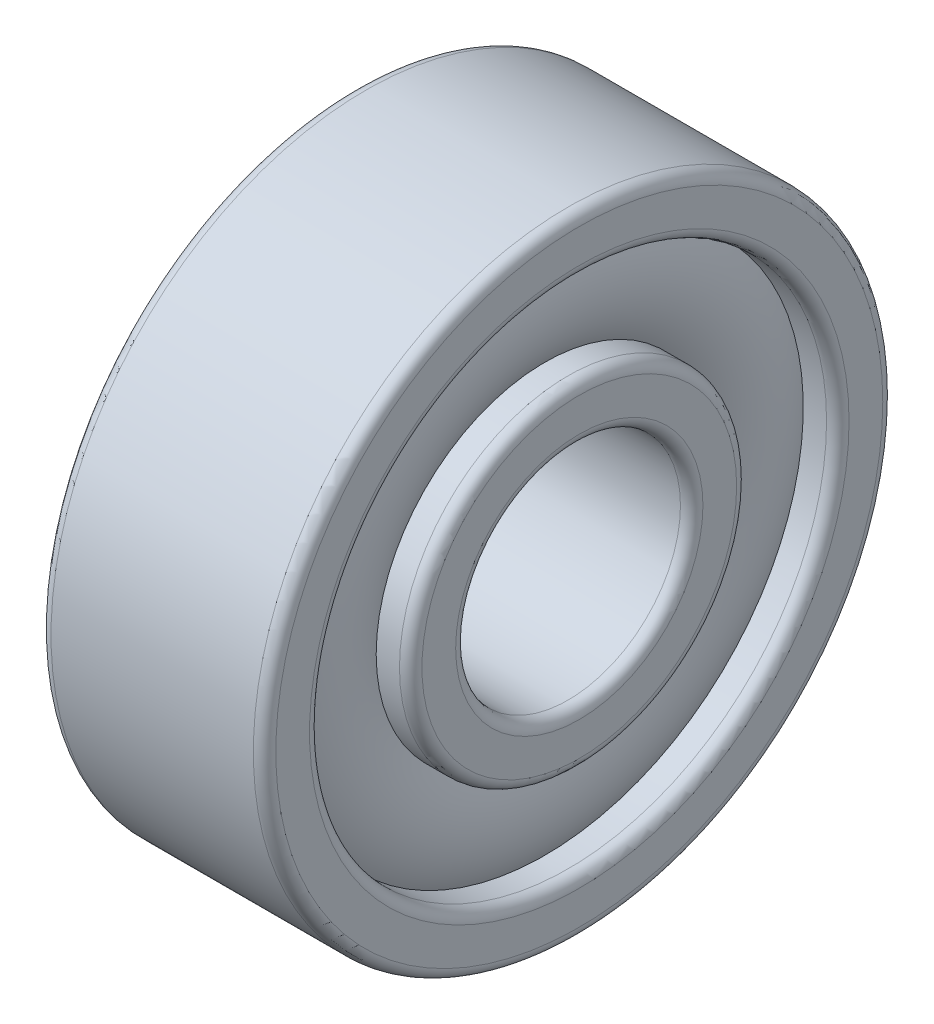
ISO-10303-21;
HEADER;
FILE_DESCRIPTION(('STEP AP214'),'2;1');
FILE_NAME('part.step','',(''),(''),'','','');
FILE_SCHEMA(('AUTOMOTIVE_DESIGN { 1 0 10303 214 1 1 1 1 }'));
ENDSEC;
DATA;
#1=APPLICATION_CONTEXT('core data for automotive mechanical design processes');
#2=APPLICATION_PROTOCOL_DEFINITION('international standard','automotive_design',2000,#1);
#3=PRODUCT_CONTEXT('',#1,'mechanical');
#4=PRODUCT('Part','Part','',(#3));
#5=PRODUCT_RELATED_PRODUCT_CATEGORY('part','',(#4));
#6=PRODUCT_DEFINITION_FORMATION('','',#4);
#7=PRODUCT_DEFINITION_CONTEXT('part definition',#1,'design');
#8=PRODUCT_DEFINITION('design','',#6,#7);
#9=PRODUCT_DEFINITION_SHAPE('','',#8);
#10=(LENGTH_UNIT() NAMED_UNIT(*) SI_UNIT(.MILLI.,.METRE.));
#11=(NAMED_UNIT(*) PLANE_ANGLE_UNIT() SI_UNIT($,.RADIAN.));
#12=(NAMED_UNIT(*) SI_UNIT($,.STERADIAN.) SOLID_ANGLE_UNIT());
#13=UNCERTAINTY_MEASURE_WITH_UNIT(LENGTH_MEASURE(1.E-05),#10,'distance_accuracy_value','');
#14=(GEOMETRIC_REPRESENTATION_CONTEXT(3) GLOBAL_UNCERTAINTY_ASSIGNED_CONTEXT((#13)) GLOBAL_UNIT_ASSIGNED_CONTEXT((#10,
#11,#12)) REPRESENTATION_CONTEXT('',''));
#15=CARTESIAN_POINT('',(0.,0.,0.));
#16=DIRECTION('',(0.,0.,1.));
#17=DIRECTION('',(1.,0.,0.));
#18=AXIS2_PLACEMENT_3D('',#15,#16,#17);
#19=CARTESIAN_POINT('',(-5.57838983751132,0.,0.));
#20=DIRECTION('',(-1.,0.,0.));
#21=DIRECTION('',(0.,0.,1.));
#22=AXIS2_PLACEMENT_3D('',#19,#20,#21);
#23=CYLINDRICAL_SURFACE('',#22,3.75);
#24=CARTESIAN_POINT('',(2.25,0.,0.));
#25=DIRECTION('',(1.,0.,0.));
#26=DIRECTION('',(0.,0.,-1.));
#27=AXIS2_PLACEMENT_3D('',#24,#25,#26);
#28=CIRCLE('',#27,3.75);
#29=CARTESIAN_POINT('',(2.25,0.,-3.75));
#30=VERTEX_POINT('',#29);
#31=EDGE_CURVE('E78',#30,#30,#28,.F.);
#32=ORIENTED_EDGE('',*,*,#31,.T.);
#33=EDGE_LOOP('',(#32));
#34=FACE_BOUND('',#33,.T.);
#35=CARTESIAN_POINT('',(1.73205080756888,0.,0.));
#36=DIRECTION('',(-1.,0.,0.));
#37=DIRECTION('',(0.,0.,1.));
#38=AXIS2_PLACEMENT_3D('',#35,#36,#37);
#39=CIRCLE('',#38,3.75);
#40=CARTESIAN_POINT('',(1.73205080756888,0.,3.75));
#41=VERTEX_POINT('',#40);
#42=EDGE_CURVE('E93',#41,#41,#39,.T.);
#43=ORIENTED_EDGE('',*,*,#42,.F.);
#44=EDGE_LOOP('',(#43));
#45=FACE_BOUND('',#44,.T.);
#46=ADVANCED_FACE('F37',(#34,#45),#23,.T.);
#47=CARTESIAN_POINT('',(0.,0.,0.));
#48=DIRECTION('',(-1.,0.,0.));
#49=DIRECTION('',(0.,0.,1.));
#50=AXIS2_PLACEMENT_3D('',#47,#48,#49);
#51=TOROIDAL_SURFACE('',#50,4.75,2.);
#52=CARTESIAN_POINT('',(1.73205080756888,0.,0.));
#53=DIRECTION('',(-1.,0.,0.));
#54=DIRECTION('',(0.,0.,1.));
#55=AXIS2_PLACEMENT_3D('',#52,#53,#54);
#56=CIRCLE('',#55,5.75);
#57=CARTESIAN_POINT('',(1.73205080756888,0.,5.75));
#58=VERTEX_POINT('',#57);
#59=EDGE_CURVE('E96',#58,#58,#56,.T.);
#60=ORIENTED_EDGE('',*,*,#59,.F.);
#61=EDGE_LOOP('',(#60));
#62=FACE_BOUND('',#61,.T.);
#63=ORIENTED_EDGE('',*,*,#42,.T.);
#64=EDGE_LOOP('',(#63));
#65=FACE_BOUND('',#64,.T.);
#66=ADVANCED_FACE('F126',(#62,#65),#51,.T.);
#67=CARTESIAN_POINT('',(-5.57838983751132,0.,0.));
#68=DIRECTION('',(-1.,0.,0.));
#69=DIRECTION('',(0.,0.,1.));
#70=AXIS2_PLACEMENT_3D('',#67,#68,#69);
#71=CYLINDRICAL_SURFACE('',#70,5.75);
#72=CARTESIAN_POINT('',(2.25,0.,0.));
#73=DIRECTION('',(1.,0.,0.));
#74=DIRECTION('',(0.,0.,-1.));
#75=AXIS2_PLACEMENT_3D('',#72,#73,#74);
#76=CIRCLE('',#75,5.75);
#77=CARTESIAN_POINT('',(2.25,0.,-5.75));
#78=VERTEX_POINT('',#77);
#79=EDGE_CURVE('E48',#78,#78,#76,.T.);
#80=ORIENTED_EDGE('',*,*,#79,.T.);
#81=EDGE_LOOP('',(#80));
#82=FACE_BOUND('',#81,.T.);
#83=ORIENTED_EDGE('',*,*,#59,.T.);
#84=EDGE_LOOP('',(#83));
#85=FACE_BOUND('',#84,.T.);
#86=ADVANCED_FACE('F132',(#82,#85),#71,.F.);
#87=CARTESIAN_POINT('',(2.5,0.,0.));
#88=DIRECTION('',(1.,0.,0.));
#89=DIRECTION('',(0.,0.,-1.));
#90=AXIS2_PLACEMENT_3D('',#87,#88,#89);
#91=PLANE('',#90);
#92=CARTESIAN_POINT('',(2.5,0.,0.));
#93=DIRECTION('',(1.,0.,0.));
#94=DIRECTION('',(0.,0.,-1.));
#95=AXIS2_PLACEMENT_3D('',#92,#93,#94);
#96=CIRCLE('',#95,6.);
#97=CARTESIAN_POINT('',(2.5,0.,-6.));
#98=VERTEX_POINT('',#97);
#99=EDGE_CURVE('E52',#98,#98,#96,.F.);
#100=ORIENTED_EDGE('',*,*,#99,.T.);
#101=EDGE_LOOP('',(#100));
#102=FACE_BOUND('',#101,.T.);
#103=CARTESIAN_POINT('',(2.5,0.,0.));
#104=DIRECTION('',(1.,0.,0.));
#105=DIRECTION('',(0.,0.,-1.));
#106=AXIS2_PLACEMENT_3D('',#103,#104,#105);
#107=CIRCLE('',#106,6.75);
#108=CARTESIAN_POINT('',(2.5,0.,-6.75));
#109=VERTEX_POINT('',#108);
#110=EDGE_CURVE('E57',#109,#109,#107,.T.);
#111=ORIENTED_EDGE('',*,*,#110,.T.);
#112=EDGE_LOOP('',(#111));
#113=FACE_BOUND('',#112,.T.);
#114=ADVANCED_FACE('F172',(#102,#113),#91,.T.);
#115=CARTESIAN_POINT('',(-5.57838983751132,0.,0.));
#116=DIRECTION('',(-1.,0.,0.));
#117=DIRECTION('',(0.,0.,1.));
#118=AXIS2_PLACEMENT_3D('',#115,#116,#117);
#119=CYLINDRICAL_SURFACE('',#118,7.);
#120=CARTESIAN_POINT('',(2.25,0.,0.));
#121=DIRECTION('',(1.,0.,0.));
#122=DIRECTION('',(0.,0.,-1.));
#123=AXIS2_PLACEMENT_3D('',#120,#121,#122);
#124=CIRCLE('',#123,7.);
#125=CARTESIAN_POINT('',(2.25,0.,-7.));
#126=VERTEX_POINT('',#125);
#127=EDGE_CURVE('E10',#126,#126,#124,.F.);
#128=ORIENTED_EDGE('',*,*,#127,.T.);
#129=EDGE_LOOP('',(#128));
#130=FACE_BOUND('',#129,.T.);
#131=CARTESIAN_POINT('',(-2.25,0.,0.));
#132=DIRECTION('',(1.,0.,0.));
#133=DIRECTION('',(0.,0.,-1.));
#134=AXIS2_PLACEMENT_3D('',#131,#132,#133);
#135=CIRCLE('',#134,7.);
#136=CARTESIAN_POINT('',(-2.25,0.,-7.));
#137=VERTEX_POINT('',#136);
#138=EDGE_CURVE('E44',#137,#137,#135,.T.);
#139=ORIENTED_EDGE('',*,*,#138,.T.);
#140=EDGE_LOOP('',(#139));
#141=FACE_BOUND('',#140,.T.);
#142=ADVANCED_FACE('F122',(#130,#141),#119,.T.);
#143=CARTESIAN_POINT('',(-2.5,0.,0.));
#144=DIRECTION('',(1.,0.,0.));
#145=DIRECTION('',(0.,0.,-1.));
#146=AXIS2_PLACEMENT_3D('',#143,#144,#145);
#147=PLANE('',#146);
#148=CARTESIAN_POINT('',(-2.5,0.,0.));
#149=DIRECTION('',(1.,0.,0.));
#150=DIRECTION('',(0.,0.,-1.));
#151=AXIS2_PLACEMENT_3D('',#148,#149,#150);
#152=CIRCLE('',#151,6.);
#153=CARTESIAN_POINT('',(-2.5,0.,-6.));
#154=VERTEX_POINT('',#153);
#155=EDGE_CURVE('E60',#154,#154,#152,.T.);
#156=ORIENTED_EDGE('',*,*,#155,.T.);
#157=EDGE_LOOP('',(#156));
#158=FACE_BOUND('',#157,.T.);
#159=CARTESIAN_POINT('',(-2.5,0.,0.));
#160=DIRECTION('',(1.,0.,0.));
#161=DIRECTION('',(0.,0.,-1.));
#162=AXIS2_PLACEMENT_3D('',#159,#160,#161);
#163=CIRCLE('',#162,6.75);
#164=CARTESIAN_POINT('',(-2.5,0.,-6.75));
#165=VERTEX_POINT('',#164);
#166=EDGE_CURVE('E63',#165,#165,#163,.F.);
#167=ORIENTED_EDGE('',*,*,#166,.T.);
#168=EDGE_LOOP('',(#167));
#169=FACE_BOUND('',#168,.T.);
#170=ADVANCED_FACE('F116',(#158,#169),#147,.F.);
#171=CARTESIAN_POINT('',(-5.57838983751132,0.,0.));
#172=DIRECTION('',(-1.,0.,0.));
#173=DIRECTION('',(0.,0.,1.));
#174=AXIS2_PLACEMENT_3D('',#171,#172,#173);
#175=CYLINDRICAL_SURFACE('',#174,5.75);
#176=CARTESIAN_POINT('',(-2.25,0.,0.));
#177=DIRECTION('',(1.,0.,0.));
#178=DIRECTION('',(0.,0.,-1.));
#179=AXIS2_PLACEMENT_3D('',#176,#177,#178);
#180=CIRCLE('',#179,5.75);
#181=CARTESIAN_POINT('',(-2.25,0.,-5.75));
#182=VERTEX_POINT('',#181);
#183=EDGE_CURVE('E66',#182,#182,#180,.F.);
#184=ORIENTED_EDGE('',*,*,#183,.T.);
#185=EDGE_LOOP('',(#184));
#186=FACE_BOUND('',#185,.T.);
#187=CARTESIAN_POINT('',(-1.73205080756888,0.,0.));
#188=DIRECTION('',(-1.,0.,0.));
#189=DIRECTION('',(0.,0.,1.));
#190=AXIS2_PLACEMENT_3D('',#187,#188,#189);
#191=CIRCLE('',#190,5.75);
#192=CARTESIAN_POINT('',(-1.73205080756888,0.,5.75));
#193=VERTEX_POINT('',#192);
#194=EDGE_CURVE('E99',#193,#193,#191,.T.);
#195=ORIENTED_EDGE('',*,*,#194,.F.);
#196=EDGE_LOOP('',(#195));
#197=FACE_BOUND('',#196,.T.);
#198=ADVANCED_FACE('F111',(#186,#197),#175,.F.);
#199=CARTESIAN_POINT('',(0.,0.,0.));
#200=DIRECTION('',(-1.,0.,0.));
#201=DIRECTION('',(0.,0.,1.));
#202=AXIS2_PLACEMENT_3D('',#199,#200,#201);
#203=TOROIDAL_SURFACE('',#202,4.75,2.);
#204=CARTESIAN_POINT('',(-1.73205080756888,0.,0.));
#205=DIRECTION('',(-1.,0.,0.));
#206=DIRECTION('',(0.,0.,1.));
#207=AXIS2_PLACEMENT_3D('',#204,#205,#206);
#208=CIRCLE('',#207,3.75);
#209=CARTESIAN_POINT('',(-1.73205080756888,0.,3.75));
#210=VERTEX_POINT('',#209);
#211=EDGE_CURVE('E102',#210,#210,#208,.T.);
#212=ORIENTED_EDGE('',*,*,#211,.F.);
#213=EDGE_LOOP('',(#212));
#214=FACE_BOUND('',#213,.T.);
#215=ORIENTED_EDGE('',*,*,#194,.T.);
#216=EDGE_LOOP('',(#215));
#217=FACE_BOUND('',#216,.T.);
#218=ADVANCED_FACE('F108',(#214,#217),#203,.T.);
#219=CARTESIAN_POINT('',(-5.57838983751132,0.,0.));
#220=DIRECTION('',(-1.,0.,0.));
#221=DIRECTION('',(0.,0.,1.));
#222=AXIS2_PLACEMENT_3D('',#219,#220,#221);
#223=CYLINDRICAL_SURFACE('',#222,3.75);
#224=CARTESIAN_POINT('',(-2.25,0.,0.));
#225=DIRECTION('',(-1.,0.,0.));
#226=DIRECTION('',(0.,0.,1.));
#227=AXIS2_PLACEMENT_3D('',#224,#225,#226);
#228=CIRCLE('',#227,3.75);
#229=CARTESIAN_POINT('',(-2.25,0.,3.75));
#230=VERTEX_POINT('',#229);
#231=EDGE_CURVE('E69',#230,#230,#228,.F.);
#232=ORIENTED_EDGE('',*,*,#231,.T.);
#233=EDGE_LOOP('',(#232));
#234=FACE_BOUND('',#233,.T.);
#235=ORIENTED_EDGE('',*,*,#211,.T.);
#236=EDGE_LOOP('',(#235));
#237=FACE_BOUND('',#236,.T.);
#238=ADVANCED_FACE('F106',(#234,#237),#223,.T.);
#239=CARTESIAN_POINT('',(-2.5,0.,0.));
#240=DIRECTION('',(-1.,0.,0.));
#241=DIRECTION('',(0.,0.,1.));
#242=AXIS2_PLACEMENT_3D('',#239,#240,#241);
#243=PLANE('',#242);
#244=CARTESIAN_POINT('',(-2.5,0.,0.));
#245=DIRECTION('',(-1.,0.,0.));
#246=DIRECTION('',(0.,0.,1.));
#247=AXIS2_PLACEMENT_3D('',#244,#245,#246);
#248=CIRCLE('',#247,2.75);
#249=CARTESIAN_POINT('',(-2.5,0.,2.75));
#250=VERTEX_POINT('',#249);
#251=EDGE_CURVE('E72',#250,#250,#248,.F.);
#252=ORIENTED_EDGE('',*,*,#251,.T.);
#253=EDGE_LOOP('',(#252));
#254=FACE_BOUND('',#253,.T.);
#255=CARTESIAN_POINT('',(-2.5,0.,0.));
#256=DIRECTION('',(-1.,0.,0.));
#257=DIRECTION('',(0.,0.,1.));
#258=AXIS2_PLACEMENT_3D('',#255,#256,#257);
#259=CIRCLE('',#258,3.5);
#260=CARTESIAN_POINT('',(-2.5,0.,3.5));
#261=VERTEX_POINT('',#260);
#262=EDGE_CURVE('E75',#261,#261,#259,.T.);
#263=ORIENTED_EDGE('',*,*,#262,.T.);
#264=EDGE_LOOP('',(#263));
#265=FACE_BOUND('',#264,.T.);
#266=ADVANCED_FACE('F247',(#254,#265),#243,.T.);
#267=CARTESIAN_POINT('',(2.5,0.,0.));
#268=DIRECTION('',(1.,0.,0.));
#269=DIRECTION('',(0.,0.,-1.));
#270=AXIS2_PLACEMENT_3D('',#267,#268,#269);
#271=PLANE('',#270);
#272=CARTESIAN_POINT('',(2.5,0.,0.));
#273=DIRECTION('',(1.,0.,0.));
#274=DIRECTION('',(0.,0.,-1.));
#275=AXIS2_PLACEMENT_3D('',#272,#273,#274);
#276=CIRCLE('',#275,2.75);
#277=CARTESIAN_POINT('',(2.5,0.,-2.75));
#278=VERTEX_POINT('',#277);
#279=EDGE_CURVE('E87',#278,#278,#276,.F.);
#280=ORIENTED_EDGE('',*,*,#279,.T.);
#281=EDGE_LOOP('',(#280));
#282=FACE_BOUND('',#281,.T.);
#283=CARTESIAN_POINT('',(2.5,0.,0.));
#284=DIRECTION('',(1.,0.,0.));
#285=DIRECTION('',(0.,0.,-1.));
#286=AXIS2_PLACEMENT_3D('',#283,#284,#285);
#287=CIRCLE('',#286,3.5);
#288=CARTESIAN_POINT('',(2.5,0.,-3.5));
#289=VERTEX_POINT('',#288);
#290=EDGE_CURVE('E90',#289,#289,#287,.T.);
#291=ORIENTED_EDGE('',*,*,#290,.T.);
#292=EDGE_LOOP('',(#291));
#293=FACE_BOUND('',#292,.T.);
#294=ADVANCED_FACE('F257',(#282,#293),#271,.T.);
#295=CARTESIAN_POINT('',(2.5,0.,0.));
#296=DIRECTION('',(-1.,0.,0.));
#297=DIRECTION('',(0.,0.,1.));
#298=AXIS2_PLACEMENT_3D('',#295,#296,#297);
#299=CYLINDRICAL_SURFACE('',#298,2.5);
#300=CARTESIAN_POINT('',(2.25,0.,0.));
#301=DIRECTION('',(1.,0.,0.));
#302=DIRECTION('',(0.,0.,-1.));
#303=AXIS2_PLACEMENT_3D('',#300,#301,#302);
#304=CIRCLE('',#303,2.5);
#305=CARTESIAN_POINT('',(2.25,0.,-2.5));
#306=VERTEX_POINT('',#305);
#307=EDGE_CURVE('E81',#306,#306,#304,.T.);
#308=ORIENTED_EDGE('',*,*,#307,.T.);
#309=EDGE_LOOP('',(#308));
#310=FACE_BOUND('',#309,.T.);
#311=CARTESIAN_POINT('',(-2.25,0.,0.));
#312=DIRECTION('',(-1.,0.,0.));
#313=DIRECTION('',(0.,0.,1.));
#314=AXIS2_PLACEMENT_3D('',#311,#312,#313);
#315=CIRCLE('',#314,2.5);
#316=CARTESIAN_POINT('',(-2.25,0.,2.5));
#317=VERTEX_POINT('',#316);
#318=EDGE_CURVE('E84',#317,#317,#315,.T.);
#319=ORIENTED_EDGE('',*,*,#318,.T.);
#320=EDGE_LOOP('',(#319));
#321=FACE_BOUND('',#320,.T.);
#322=ADVANCED_FACE('F142',(#310,#321),#299,.F.);
#323=CARTESIAN_POINT('',(2.25,0.,0.));
#324=DIRECTION('',(1.,0.,0.));
#325=DIRECTION('',(0.,0.,-1.));
#326=AXIS2_PLACEMENT_3D('',#323,#324,#325);
#327=TOROIDAL_SURFACE('',#326,2.75,0.25);
#328=ORIENTED_EDGE('',*,*,#307,.F.);
#329=EDGE_LOOP('',(#328));
#330=FACE_BOUND('',#329,.T.);
#331=ORIENTED_EDGE('',*,*,#279,.F.);
#332=EDGE_LOOP('',(#331));
#333=FACE_BOUND('',#332,.T.);
#334=ADVANCED_FACE('F138',(#330,#333),#327,.T.);
#335=CARTESIAN_POINT('',(2.25,0.,0.));
#336=DIRECTION('',(1.,0.,0.));
#337=DIRECTION('',(0.,0.,-1.));
#338=AXIS2_PLACEMENT_3D('',#335,#336,#337);
#339=TOROIDAL_SURFACE('',#338,3.5,0.25);
#340=ORIENTED_EDGE('',*,*,#290,.F.);
#341=EDGE_LOOP('',(#340));
#342=FACE_BOUND('',#341,.T.);
#343=ORIENTED_EDGE('',*,*,#31,.F.);
#344=EDGE_LOOP('',(#343));
#345=FACE_BOUND('',#344,.T.);
#346=ADVANCED_FACE('F141',(#342,#345),#339,.T.);
#347=CARTESIAN_POINT('',(-2.25,0.,0.));
#348=DIRECTION('',(-1.,0.,0.));
#349=DIRECTION('',(0.,0.,1.));
#350=AXIS2_PLACEMENT_3D('',#347,#348,#349);
#351=TOROIDAL_SURFACE('',#350,2.75,0.25);
#352=ORIENTED_EDGE('',*,*,#251,.F.);
#353=EDGE_LOOP('',(#352));
#354=FACE_BOUND('',#353,.T.);
#355=ORIENTED_EDGE('',*,*,#318,.F.);
#356=EDGE_LOOP('',(#355));
#357=FACE_BOUND('',#356,.T.);
#358=ADVANCED_FACE('F146',(#354,#357),#351,.T.);
#359=CARTESIAN_POINT('',(-2.25,0.,0.));
#360=DIRECTION('',(-1.,0.,0.));
#361=DIRECTION('',(0.,0.,1.));
#362=AXIS2_PLACEMENT_3D('',#359,#360,#361);
#363=TOROIDAL_SURFACE('',#362,3.5,0.25);
#364=ORIENTED_EDGE('',*,*,#231,.F.);
#365=EDGE_LOOP('',(#364));
#366=FACE_BOUND('',#365,.T.);
#367=ORIENTED_EDGE('',*,*,#262,.F.);
#368=EDGE_LOOP('',(#367));
#369=FACE_BOUND('',#368,.T.);
#370=ADVANCED_FACE('F150',(#366,#369),#363,.T.);
#371=CARTESIAN_POINT('',(-2.25,0.,0.));
#372=DIRECTION('',(1.,0.,0.));
#373=DIRECTION('',(0.,0.,-1.));
#374=AXIS2_PLACEMENT_3D('',#371,#372,#373);
#375=TOROIDAL_SURFACE('',#374,6.,0.25);
#376=ORIENTED_EDGE('',*,*,#155,.F.);
#377=EDGE_LOOP('',(#376));
#378=FACE_BOUND('',#377,.T.);
#379=ORIENTED_EDGE('',*,*,#183,.F.);
#380=EDGE_LOOP('',(#379));
#381=FACE_BOUND('',#380,.T.);
#382=ADVANCED_FACE('F154',(#378,#381),#375,.T.);
#383=CARTESIAN_POINT('',(2.25,0.,0.));
#384=DIRECTION('',(1.,0.,0.));
#385=DIRECTION('',(0.,0.,-1.));
#386=AXIS2_PLACEMENT_3D('',#383,#384,#385);
#387=TOROIDAL_SURFACE('',#386,6.,0.25);
#388=ORIENTED_EDGE('',*,*,#79,.F.);
#389=EDGE_LOOP('',(#388));
#390=FACE_BOUND('',#389,.T.);
#391=ORIENTED_EDGE('',*,*,#99,.F.);
#392=EDGE_LOOP('',(#391));
#393=FACE_BOUND('',#392,.T.);
#394=ADVANCED_FACE('F158',(#390,#393),#387,.T.);
#395=CARTESIAN_POINT('',(2.25,0.,0.));
#396=DIRECTION('',(1.,0.,0.));
#397=DIRECTION('',(0.,0.,-1.));
#398=AXIS2_PLACEMENT_3D('',#395,#396,#397);
#399=TOROIDAL_SURFACE('',#398,6.75,0.25);
#400=ORIENTED_EDGE('',*,*,#110,.F.);
#401=EDGE_LOOP('',(#400));
#402=FACE_BOUND('',#401,.T.);
#403=ORIENTED_EDGE('',*,*,#127,.F.);
#404=EDGE_LOOP('',(#403));
#405=FACE_BOUND('',#404,.T.);
#406=ADVANCED_FACE('F161',(#402,#405),#399,.T.);
#407=CARTESIAN_POINT('',(-2.25,0.,0.));
#408=DIRECTION('',(1.,0.,0.));
#409=DIRECTION('',(0.,0.,-1.));
#410=AXIS2_PLACEMENT_3D('',#407,#408,#409);
#411=TOROIDAL_SURFACE('',#410,6.75,0.25);
#412=ORIENTED_EDGE('',*,*,#138,.F.);
#413=EDGE_LOOP('',(#412));
#414=FACE_BOUND('',#413,.T.);
#415=ORIENTED_EDGE('',*,*,#166,.F.);
#416=EDGE_LOOP('',(#415));
#417=FACE_BOUND('',#416,.T.);
#418=ADVANCED_FACE('F39',(#414,#417),#411,.T.);
#419=CLOSED_SHELL('',(#46,#66,#86,#114,#142,#170,#198,#218,#238,#266,#294,#322,#334,#346,#358,
#370,#382,#394,#406,#418));
#420=MANIFOLD_SOLID_BREP('B2',#419);
#421=ADVANCED_BREP_SHAPE_REPRESENTATION('',(#18,#420),#14);
#422=SHAPE_DEFINITION_REPRESENTATION(#9,#421);
ENDSEC;
END-ISO-10303-21;
